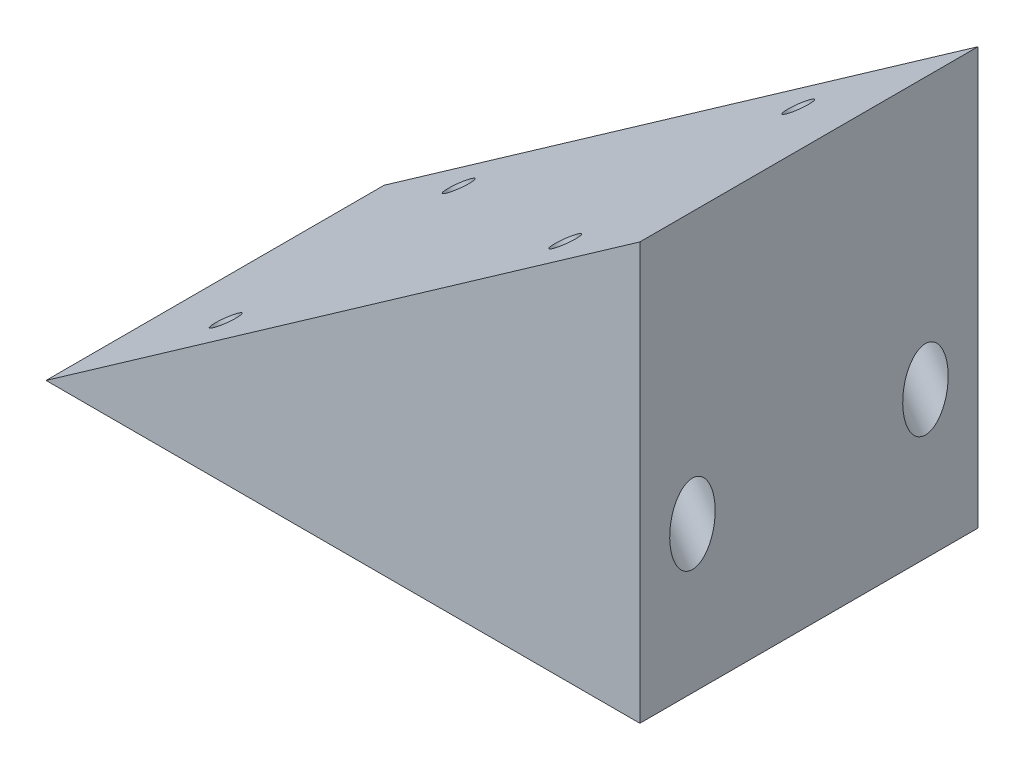
ISO-10303-21;
HEADER;
FILE_DESCRIPTION(('STEP AP214'),'2;1');
FILE_NAME('part.step','',(''),(''),'','','');
FILE_SCHEMA(('AUTOMOTIVE_DESIGN { 1 0 10303 214 1 1 1 1 }'));
ENDSEC;
DATA;
#1=APPLICATION_CONTEXT('core data for automotive mechanical design processes');
#2=APPLICATION_PROTOCOL_DEFINITION('international standard','automotive_design',2000,#1);
#3=PRODUCT_CONTEXT('',#1,'mechanical');
#4=PRODUCT('Part','Part','',(#3));
#5=PRODUCT_RELATED_PRODUCT_CATEGORY('part','',(#4));
#6=PRODUCT_DEFINITION_FORMATION('','',#4);
#7=PRODUCT_DEFINITION_CONTEXT('part definition',#1,'design');
#8=PRODUCT_DEFINITION('design','',#6,#7);
#9=PRODUCT_DEFINITION_SHAPE('','',#8);
#10=(LENGTH_UNIT() NAMED_UNIT(*) SI_UNIT(.MILLI.,.METRE.));
#11=(NAMED_UNIT(*) PLANE_ANGLE_UNIT() SI_UNIT($,.RADIAN.));
#12=(NAMED_UNIT(*) SI_UNIT($,.STERADIAN.) SOLID_ANGLE_UNIT());
#13=UNCERTAINTY_MEASURE_WITH_UNIT(LENGTH_MEASURE(1.E-05),#10,'distance_accuracy_value','');
#14=(GEOMETRIC_REPRESENTATION_CONTEXT(3) GLOBAL_UNCERTAINTY_ASSIGNED_CONTEXT((#13)) GLOBAL_UNIT_ASSIGNED_CONTEXT((#10,
#11,#12)) REPRESENTATION_CONTEXT('',''));
#15=CARTESIAN_POINT('',(0.,0.,0.));
#16=DIRECTION('',(0.,0.,1.));
#17=DIRECTION('',(1.,0.,0.));
#18=AXIS2_PLACEMENT_3D('',#15,#16,#17);
#19=CARTESIAN_POINT('',(52.25,73.36,29.75));
#20=DIRECTION('',(-1.,0.,0.));
#21=DIRECTION('',(0.,0.,1.));
#22=AXIS2_PLACEMENT_3D('',#19,#20,#21);
#23=PLANE('',#22);
#24=CARTESIAN_POINT('',(52.25,25.7770596393157,-20.5));
#25=DIRECTION('',(-1.,0.,0.));
#26=DIRECTION('',(0.,-1.,0.));
#27=AXIS2_PLACEMENT_3D('',#24,#25,#26);
#28=ELLIPSE('',#27,6.96178021711686,3.99999999999999);
#29=CARTESIAN_POINT('',(52.25,18.8152794221989,-20.5));
#30=VERTEX_POINT('',#29);
#31=EDGE_CURVE('E43',#30,#30,#28,.T.);
#32=ORIENTED_EDGE('',*,*,#31,.T.);
#33=EDGE_LOOP('',(#32));
#34=FACE_BOUND('',#33,.T.);
#35=CARTESIAN_POINT('',(52.25,25.7770596393157,20.5));
#36=DIRECTION('',(-1.,0.,0.));
#37=DIRECTION('',(0.,-1.,0.));
#38=AXIS2_PLACEMENT_3D('',#35,#36,#37);
#39=ELLIPSE('',#38,6.96178021711686,3.99999999999999);
#40=CARTESIAN_POINT('',(52.25,18.8152794221989,20.5));
#41=VERTEX_POINT('',#40);
#42=EDGE_CURVE('E117',#41,#41,#39,.T.);
#43=ORIENTED_EDGE('',*,*,#42,.T.);
#44=EDGE_LOOP('',(#43));
#45=FACE_BOUND('',#44,.T.);
#46=DIRECTION('',(0.,0.,-1.));
#47=VECTOR('',#46,1.);
#48=CARTESIAN_POINT('',(52.25,0.,29.75));
#49=LINE('',#48,#47);
#50=CARTESIAN_POINT('',(52.25,0.,29.75));
#51=VERTEX_POINT('',#50);
#52=CARTESIAN_POINT('',(52.25,0.,-29.75));
#53=VERTEX_POINT('',#52);
#54=EDGE_CURVE('E87',#51,#53,#49,.T.);
#55=ORIENTED_EDGE('',*,*,#54,.T.);
#56=DIRECTION('',(0.,-1.,0.));
#57=VECTOR('',#56,1.);
#58=CARTESIAN_POINT('',(52.25,73.36,-29.75));
#59=LINE('',#58,#57);
#60=CARTESIAN_POINT('',(52.25,73.36,-29.75));
#61=VERTEX_POINT('',#60);
#62=EDGE_CURVE('E11',#61,#53,#59,.T.);
#63=ORIENTED_EDGE('',*,*,#62,.F.);
#64=DIRECTION('',(0.,0.,-1.));
#65=VECTOR('',#64,1.);
#66=CARTESIAN_POINT('',(52.25,73.36,29.75));
#67=LINE('',#66,#65);
#68=CARTESIAN_POINT('',(52.25,73.36,29.75));
#69=VERTEX_POINT('',#68);
#70=EDGE_CURVE('E76',#69,#61,#67,.T.);
#71=ORIENTED_EDGE('',*,*,#70,.F.);
#72=DIRECTION('',(0.,-1.,0.));
#73=VECTOR('',#72,1.);
#74=CARTESIAN_POINT('',(52.25,73.36,29.75));
#75=LINE('',#74,#73);
#76=EDGE_CURVE('E48',#69,#51,#75,.T.);
#77=ORIENTED_EDGE('',*,*,#76,.T.);
#78=EDGE_LOOP('',(#55,#63,#71,#77));
#79=FACE_BOUND('',#78,.T.);
#80=ADVANCED_FACE('F40',(#34,#45,#79),#23,.F.);
#81=CARTESIAN_POINT('',(-52.25,73.36,-29.75));
#82=DIRECTION('',(0.,0.,1.));
#83=DIRECTION('',(1.,0.,0.));
#84=AXIS2_PLACEMENT_3D('',#81,#82,#83);
#85=PLANE('',#84);
#86=DIRECTION('',(-1.,0.,0.));
#87=VECTOR('',#86,1.);
#88=CARTESIAN_POINT('',(-52.25,0.,-29.75));
#89=LINE('',#88,#87);
#90=CARTESIAN_POINT('',(-52.25,0.,-29.75));
#91=VERTEX_POINT('',#90);
#92=EDGE_CURVE('E85',#53,#91,#89,.T.);
#93=ORIENTED_EDGE('',*,*,#92,.T.);
#94=DIRECTION('',(0.818458475917246,0.574565682232432,0.));
#95=VECTOR('',#94,1.);
#96=CARTESIAN_POINT('',(-52.25,0.,-29.75));
#97=LINE('',#96,#95);
#98=EDGE_CURVE('E64',#91,#61,#97,.T.);
#99=ORIENTED_EDGE('',*,*,#98,.T.);
#100=ORIENTED_EDGE('',*,*,#62,.T.);
#101=EDGE_LOOP('',(#93,#99,#100));
#102=FACE_BOUND('',#101,.T.);
#103=ADVANCED_FACE('F83',(#102),#85,.F.);
#104=CARTESIAN_POINT('',(-52.25,73.36,29.75));
#105=DIRECTION('',(0.,0.,-1.));
#106=DIRECTION('',(-1.,0.,0.));
#107=AXIS2_PLACEMENT_3D('',#104,#105,#106);
#108=PLANE('',#107);
#109=ORIENTED_EDGE('',*,*,#76,.F.);
#110=DIRECTION('',(0.818458475917246,0.574565682232432,0.));
#111=VECTOR('',#110,1.);
#112=CARTESIAN_POINT('',(-52.25,0.,29.75));
#113=LINE('',#112,#111);
#114=CARTESIAN_POINT('',(-52.25,0.,29.75));
#115=VERTEX_POINT('',#114);
#116=EDGE_CURVE('E78',#115,#69,#113,.T.);
#117=ORIENTED_EDGE('',*,*,#116,.F.);
#118=DIRECTION('',(1.,0.,0.));
#119=VECTOR('',#118,1.);
#120=CARTESIAN_POINT('',(-52.25,0.,29.75));
#121=LINE('',#120,#119);
#122=EDGE_CURVE('E56',#115,#51,#121,.T.);
#123=ORIENTED_EDGE('',*,*,#122,.T.);
#124=EDGE_LOOP('',(#109,#117,#123));
#125=FACE_BOUND('',#124,.T.);
#126=ADVANCED_FACE('F176',(#125),#108,.F.);
#127=CARTESIAN_POINT('',(0.,0.,0.));
#128=DIRECTION('',(0.,-1.,0.));
#129=DIRECTION('',(0.,0.,-1.));
#130=AXIS2_PLACEMENT_3D('',#127,#128,#129);
#131=PLANE('',#130);
#132=CARTESIAN_POINT('',(-18.8463205276575,0.,20.5));
#133=DIRECTION('',(0.,-1.,0.));
#134=DIRECTION('',(1.,0.,0.));
#135=AXIS2_PLACEMENT_3D('',#132,#133,#134);
#136=ELLIPSE('',#135,4.88723633232242,3.99999999999999);
#137=CARTESIAN_POINT('',(-13.959084195335,0.,20.5));
#138=VERTEX_POINT('',#137);
#139=EDGE_CURVE('E109',#138,#138,#136,.T.);
#140=ORIENTED_EDGE('',*,*,#139,.F.);
#141=EDGE_LOOP('',(#140));
#142=FACE_BOUND('',#141,.T.);
#143=CARTESIAN_POINT('',(-18.8463205276575,0.,-20.5));
#144=DIRECTION('',(0.,-1.,0.));
#145=DIRECTION('',(1.,0.,0.));
#146=AXIS2_PLACEMENT_3D('',#143,#144,#145);
#147=ELLIPSE('',#146,4.88723633232242,3.99999999999999);
#148=CARTESIAN_POINT('',(-13.959084195335,0.,-20.5));
#149=VERTEX_POINT('',#148);
#150=EDGE_CURVE('E102',#149,#149,#147,.T.);
#151=ORIENTED_EDGE('',*,*,#150,.F.);
#152=EDGE_LOOP('',(#151));
#153=FACE_BOUND('',#152,.T.);
#154=ORIENTED_EDGE('',*,*,#54,.F.);
#155=ORIENTED_EDGE('',*,*,#122,.F.);
#156=DIRECTION('',(0.,0.,1.));
#157=VECTOR('',#156,1.);
#158=CARTESIAN_POINT('',(-52.25,0.,29.75));
#159=LINE('',#158,#157);
#160=EDGE_CURVE('E92',#91,#115,#159,.T.);
#161=ORIENTED_EDGE('',*,*,#160,.F.);
#162=ORIENTED_EDGE('',*,*,#92,.F.);
#163=EDGE_LOOP('',(#154,#155,#161,#162));
#164=FACE_BOUND('',#163,.T.);
#165=ADVANCED_FACE('F218',(#142,#153,#164),#131,.T.);
#166=CARTESIAN_POINT('',(-52.25,0.,-29.75));
#167=DIRECTION('',(0.574565682232432,-0.818458475917245,0.));
#168=DIRECTION('',(0.818458475917246,0.574565682232432,0.));
#169=AXIS2_PLACEMENT_3D('',#166,#167,#168);
#170=PLANE('',#169);
#171=CARTESIAN_POINT('',(29.8737343709794,57.6516474014838,-20.5));
#172=DIRECTION('',(0.574565682232432,-0.818458475917245,0.));
#173=DIRECTION('',(0.818458475917246,0.574565682232432,0.));
#174=AXIS2_PLACEMENT_3D('',#171,#172,#173);
#175=CIRCLE('',#174,2.24999999999999);
#176=CARTESIAN_POINT('',(31.7152659417932,58.9444201865067,-20.5));
#177=VERTEX_POINT('',#176);
#178=EDGE_CURVE('E121',#177,#177,#175,.T.);
#179=ORIENTED_EDGE('',*,*,#178,.T.);
#180=EDGE_LOOP('',(#179));
#181=FACE_BOUND('',#180,.T.);
#182=CARTESIAN_POINT('',(29.8737343709794,57.6516474014838,20.5));
#183=DIRECTION('',(0.574565682232432,-0.818458475917245,0.));
#184=DIRECTION('',(0.818458475917246,0.574565682232432,0.));
#185=AXIS2_PLACEMENT_3D('',#182,#183,#184);
#186=CIRCLE('',#185,2.24999999999999);
#187=CARTESIAN_POINT('',(31.7152659417932,58.9444201865067,20.5));
#188=VERTEX_POINT('',#187);
#189=EDGE_CURVE('E114',#188,#188,#186,.T.);
#190=ORIENTED_EDGE('',*,*,#189,.T.);
#191=EDGE_LOOP('',(#190));
#192=FACE_BOUND('',#191,.T.);
#193=CARTESIAN_POINT('',(-29.8737343709795,15.7083525985162,20.5));
#194=DIRECTION('',(0.574565682232432,-0.818458475917245,0.));
#195=DIRECTION('',(0.818458475917246,0.574565682232432,0.));
#196=AXIS2_PLACEMENT_3D('',#193,#194,#195);
#197=CIRCLE('',#196,2.24999999999999);
#198=CARTESIAN_POINT('',(-28.0322028001657,17.0011253835392,20.5));
#199=VERTEX_POINT('',#198);
#200=EDGE_CURVE('E106',#199,#199,#197,.T.);
#201=ORIENTED_EDGE('',*,*,#200,.T.);
#202=EDGE_LOOP('',(#201));
#203=FACE_BOUND('',#202,.T.);
#204=CARTESIAN_POINT('',(-29.8737343709795,15.7083525985162,-20.5));
#205=DIRECTION('',(0.574565682232432,-0.818458475917245,0.));
#206=DIRECTION('',(0.818458475917246,0.574565682232432,0.));
#207=AXIS2_PLACEMENT_3D('',#204,#205,#206);
#208=CIRCLE('',#207,2.24999999999999);
#209=CARTESIAN_POINT('',(-28.0322028001657,17.0011253835392,-20.5));
#210=VERTEX_POINT('',#209);
#211=EDGE_CURVE('E99',#210,#210,#208,.T.);
#212=ORIENTED_EDGE('',*,*,#211,.T.);
#213=EDGE_LOOP('',(#212));
#214=FACE_BOUND('',#213,.T.);
#215=ORIENTED_EDGE('',*,*,#116,.T.);
#216=ORIENTED_EDGE('',*,*,#70,.T.);
#217=ORIENTED_EDGE('',*,*,#98,.F.);
#218=ORIENTED_EDGE('',*,*,#160,.T.);
#219=EDGE_LOOP('',(#215,#216,#217,#218));
#220=FACE_BOUND('',#219,.T.);
#221=ADVANCED_FACE('F77',(#181,#192,#203,#214,#220),#170,.F.);
#222=CARTESIAN_POINT('',(-1.14545025935788,-25.214571197346,-20.5));
#223=DIRECTION('',(0.574565682232432,-0.818458475917245,0.));
#224=DIRECTION('',(0.818458475917245,0.574565682232432,0.));
#225=AXIS2_PLACEMENT_3D('',#222,#223,#224);
#226=CYLINDRICAL_SURFACE('',#225,2.24999999999999);
#227=CARTESIAN_POINT('',(-26.4263402775849,10.7976017430127,-20.5));
#228=DIRECTION('',(0.574565682232432,-0.818458475917245,0.));
#229=DIRECTION('',(0.818458475917245,0.574565682232432,0.));
#230=AXIS2_PLACEMENT_3D('',#227,#228,#229);
#231=CIRCLE('',#230,2.25);
#232=CARTESIAN_POINT('',(-24.5848087067711,12.0903745280357,-20.5));
#233=VERTEX_POINT('',#232);
#234=EDGE_CURVE('E103',#233,#233,#231,.T.);
#235=ORIENTED_EDGE('',*,*,#234,.T.);
#236=EDGE_LOOP('',(#235));
#237=FACE_BOUND('',#236,.T.);
#238=ORIENTED_EDGE('',*,*,#211,.F.);
#239=EDGE_LOOP('',(#238));
#240=FACE_BOUND('',#239,.T.);
#241=ADVANCED_FACE('F149',(#237,#240),#226,.F.);
#242=CARTESIAN_POINT('',(-26.4263402775849,10.7976017430127,-16.5));
#243=DIRECTION('',(-0.574565682232432,0.818458475917245,0.));
#244=DIRECTION('',(-0.818458475917245,-0.574565682232432,0.));
#245=AXIS2_PLACEMENT_3D('',#242,#243,#244);
#246=PLANE('',#245);
#247=ORIENTED_EDGE('',*,*,#234,.F.);
#248=EDGE_LOOP('',(#247));
#249=FACE_BOUND('',#248,.T.);
#250=CARTESIAN_POINT('',(-26.4263402775849,10.7976017430127,-20.5));
#251=DIRECTION('',(0.574565682232432,-0.818458475917245,0.));
#252=DIRECTION('',(0.818458475917245,0.574565682232432,0.));
#253=AXIS2_PLACEMENT_3D('',#250,#251,#252);
#254=CIRCLE('',#253,3.99999999999999);
#255=CARTESIAN_POINT('',(-23.1525063739159,13.0958644719425,-20.5));
#256=VERTEX_POINT('',#255);
#257=EDGE_CURVE('E113',#256,#256,#254,.T.);
#258=ORIENTED_EDGE('',*,*,#257,.T.);
#259=EDGE_LOOP('',(#258));
#260=FACE_BOUND('',#259,.T.);
#261=ADVANCED_FACE('F152',(#249,#260),#246,.F.);
#262=CARTESIAN_POINT('',(-1.14545025935788,-25.214571197346,-20.5));
#263=DIRECTION('',(0.574565682232432,-0.818458475917245,0.));
#264=DIRECTION('',(0.818458475917245,0.574565682232432,0.));
#265=AXIS2_PLACEMENT_3D('',#262,#263,#264);
#266=CYLINDRICAL_SURFACE('',#265,3.99999999999999);
#267=ORIENTED_EDGE('',*,*,#150,.T.);
#268=EDGE_LOOP('',(#267));
#269=FACE_BOUND('',#268,.T.);
#270=ORIENTED_EDGE('',*,*,#257,.F.);
#271=EDGE_LOOP('',(#270));
#272=FACE_BOUND('',#271,.T.);
#273=ADVANCED_FACE('F155',(#269,#272),#266,.F.);
#274=CARTESIAN_POINT('',(-1.14545025935788,-25.214571197346,20.5));
#275=DIRECTION('',(0.574565682232432,-0.818458475917245,0.));
#276=DIRECTION('',(0.818458475917245,0.574565682232432,0.));
#277=AXIS2_PLACEMENT_3D('',#274,#275,#276);
#278=CYLINDRICAL_SURFACE('',#277,2.24999999999999);
#279=CARTESIAN_POINT('',(-26.4263402775849,10.7976017430127,20.5));
#280=DIRECTION('',(0.574565682232432,-0.818458475917245,0.));
#281=DIRECTION('',(0.818458475917245,0.574565682232432,0.));
#282=AXIS2_PLACEMENT_3D('',#279,#280,#281);
#283=CIRCLE('',#282,2.25);
#284=CARTESIAN_POINT('',(-24.5848087067711,12.0903745280357,20.5));
#285=VERTEX_POINT('',#284);
#286=EDGE_CURVE('E110',#285,#285,#283,.T.);
#287=ORIENTED_EDGE('',*,*,#286,.T.);
#288=EDGE_LOOP('',(#287));
#289=FACE_BOUND('',#288,.T.);
#290=ORIENTED_EDGE('',*,*,#200,.F.);
#291=EDGE_LOOP('',(#290));
#292=FACE_BOUND('',#291,.T.);
#293=ADVANCED_FACE('F160',(#289,#292),#278,.F.);
#294=CARTESIAN_POINT('',(-26.4263402775849,10.7976017430127,24.5));
#295=DIRECTION('',(-0.574565682232432,0.818458475917245,0.));
#296=DIRECTION('',(-0.818458475917245,-0.574565682232432,0.));
#297=AXIS2_PLACEMENT_3D('',#294,#295,#296);
#298=PLANE('',#297);
#299=ORIENTED_EDGE('',*,*,#286,.F.);
#300=EDGE_LOOP('',(#299));
#301=FACE_BOUND('',#300,.T.);
#302=CARTESIAN_POINT('',(-26.4263402775849,10.7976017430127,20.5));
#303=DIRECTION('',(0.574565682232432,-0.818458475917245,0.));
#304=DIRECTION('',(0.818458475917245,0.574565682232432,0.));
#305=AXIS2_PLACEMENT_3D('',#302,#303,#304);
#306=CIRCLE('',#305,3.99999999999999);
#307=CARTESIAN_POINT('',(-23.1525063739159,13.0958644719425,20.5));
#308=VERTEX_POINT('',#307);
#309=EDGE_CURVE('E120',#308,#308,#306,.T.);
#310=ORIENTED_EDGE('',*,*,#309,.T.);
#311=EDGE_LOOP('',(#310));
#312=FACE_BOUND('',#311,.T.);
#313=ADVANCED_FACE('F166',(#301,#312),#298,.F.);
#314=CARTESIAN_POINT('',(-1.14545025935788,-25.214571197346,20.5));
#315=DIRECTION('',(0.574565682232432,-0.818458475917245,0.));
#316=DIRECTION('',(0.818458475917245,0.574565682232432,0.));
#317=AXIS2_PLACEMENT_3D('',#314,#315,#316);
#318=CYLINDRICAL_SURFACE('',#317,3.99999999999999);
#319=ORIENTED_EDGE('',*,*,#139,.T.);
#320=EDGE_LOOP('',(#319));
#321=FACE_BOUND('',#320,.T.);
#322=ORIENTED_EDGE('',*,*,#309,.F.);
#323=EDGE_LOOP('',(#322));
#324=FACE_BOUND('',#323,.T.);
#325=ADVANCED_FACE('F184',(#321,#324),#318,.F.);
#326=CARTESIAN_POINT('',(58.602018482601,16.7287236056215,20.5));
#327=DIRECTION('',(0.574565682232432,-0.818458475917245,0.));
#328=DIRECTION('',(0.818458475917245,0.574565682232432,0.));
#329=AXIS2_PLACEMENT_3D('',#326,#327,#328);
#330=CYLINDRICAL_SURFACE('',#329,3.99999999999999);
#331=CARTESIAN_POINT('',(33.321128464374,52.7408965459803,20.5));
#332=DIRECTION('',(0.574565682232432,-0.818458475917245,0.));
#333=DIRECTION('',(0.818458475917245,0.574565682232432,0.));
#334=AXIS2_PLACEMENT_3D('',#331,#332,#333);
#335=CIRCLE('',#334,3.99999999999999);
#336=CARTESIAN_POINT('',(36.594962368043,55.03915927491,20.5));
#337=VERTEX_POINT('',#336);
#338=EDGE_CURVE('E127',#337,#337,#335,.T.);
#339=ORIENTED_EDGE('',*,*,#338,.F.);
#340=EDGE_LOOP('',(#339));
#341=FACE_BOUND('',#340,.T.);
#342=ORIENTED_EDGE('',*,*,#42,.F.);
#343=EDGE_LOOP('',(#342));
#344=FACE_BOUND('',#343,.T.);
#345=ADVANCED_FACE('F181',(#341,#344),#330,.F.);
#346=CARTESIAN_POINT('',(58.602018482601,16.7287236056215,20.5));
#347=DIRECTION('',(0.574565682232432,-0.818458475917245,0.));
#348=DIRECTION('',(0.818458475917245,0.574565682232432,0.));
#349=AXIS2_PLACEMENT_3D('',#346,#347,#348);
#350=CYLINDRICAL_SURFACE('',#349,2.24999999999999);
#351=CARTESIAN_POINT('',(33.321128464374,52.7408965459803,20.5));
#352=DIRECTION('',(0.574565682232432,-0.818458475917245,0.));
#353=DIRECTION('',(0.818458475917245,0.574565682232432,0.));
#354=AXIS2_PLACEMENT_3D('',#351,#352,#353);
#355=CIRCLE('',#354,2.25);
#356=CARTESIAN_POINT('',(35.1626600351878,54.0336693310032,20.5));
#357=VERTEX_POINT('',#356);
#358=EDGE_CURVE('E118',#357,#357,#355,.T.);
#359=ORIENTED_EDGE('',*,*,#358,.T.);
#360=EDGE_LOOP('',(#359));
#361=FACE_BOUND('',#360,.T.);
#362=ORIENTED_EDGE('',*,*,#189,.F.);
#363=EDGE_LOOP('',(#362));
#364=FACE_BOUND('',#363,.T.);
#365=ADVANCED_FACE('F183',(#361,#364),#350,.F.);
#366=CARTESIAN_POINT('',(33.321128464374,52.7408965459803,24.5));
#367=DIRECTION('',(-0.574565682232432,0.818458475917245,0.));
#368=DIRECTION('',(-0.818458475917245,-0.574565682232432,0.));
#369=AXIS2_PLACEMENT_3D('',#366,#367,#368);
#370=PLANE('',#369);
#371=ORIENTED_EDGE('',*,*,#358,.F.);
#372=EDGE_LOOP('',(#371));
#373=FACE_BOUND('',#372,.T.);
#374=ORIENTED_EDGE('',*,*,#338,.T.);
#375=EDGE_LOOP('',(#374));
#376=FACE_BOUND('',#375,.T.);
#377=ADVANCED_FACE('F191',(#373,#376),#370,.F.);
#378=CARTESIAN_POINT('',(58.602018482601,16.7287236056215,-20.5));
#379=DIRECTION('',(0.574565682232432,-0.818458475917245,0.));
#380=DIRECTION('',(0.818458475917245,0.574565682232432,0.));
#381=AXIS2_PLACEMENT_3D('',#378,#379,#380);
#382=CYLINDRICAL_SURFACE('',#381,3.99999999999999);
#383=CARTESIAN_POINT('',(33.321128464374,52.7408965459803,-20.5));
#384=DIRECTION('',(0.574565682232432,-0.818458475917245,0.));
#385=DIRECTION('',(0.818458475917245,0.574565682232432,0.));
#386=AXIS2_PLACEMENT_3D('',#383,#384,#385);
#387=CIRCLE('',#386,3.99999999999999);
#388=CARTESIAN_POINT('',(36.594962368043,55.03915927491,-20.5));
#389=VERTEX_POINT('',#388);
#390=EDGE_CURVE('E129',#389,#389,#387,.T.);
#391=ORIENTED_EDGE('',*,*,#390,.F.);
#392=EDGE_LOOP('',(#391));
#393=FACE_BOUND('',#392,.T.);
#394=ORIENTED_EDGE('',*,*,#31,.F.);
#395=EDGE_LOOP('',(#394));
#396=FACE_BOUND('',#395,.T.);
#397=ADVANCED_FACE('F202',(#393,#396),#382,.F.);
#398=CARTESIAN_POINT('',(58.602018482601,16.7287236056215,-20.5));
#399=DIRECTION('',(0.574565682232432,-0.818458475917245,0.));
#400=DIRECTION('',(0.818458475917245,0.574565682232432,0.));
#401=AXIS2_PLACEMENT_3D('',#398,#399,#400);
#402=CYLINDRICAL_SURFACE('',#401,2.24999999999999);
#403=CARTESIAN_POINT('',(33.321128464374,52.7408965459803,-20.5));
#404=DIRECTION('',(0.574565682232432,-0.818458475917245,0.));
#405=DIRECTION('',(0.818458475917245,0.574565682232432,0.));
#406=AXIS2_PLACEMENT_3D('',#403,#404,#405);
#407=CIRCLE('',#406,2.25);
#408=CARTESIAN_POINT('',(35.1626600351878,54.0336693310032,-20.5));
#409=VERTEX_POINT('',#408);
#410=EDGE_CURVE('E123',#409,#409,#407,.T.);
#411=ORIENTED_EDGE('',*,*,#410,.T.);
#412=EDGE_LOOP('',(#411));
#413=FACE_BOUND('',#412,.T.);
#414=ORIENTED_EDGE('',*,*,#178,.F.);
#415=EDGE_LOOP('',(#414));
#416=FACE_BOUND('',#415,.T.);
#417=ADVANCED_FACE('F199',(#413,#416),#402,.F.);
#418=CARTESIAN_POINT('',(33.321128464374,52.7408965459803,-16.5));
#419=DIRECTION('',(-0.574565682232432,0.818458475917245,0.));
#420=DIRECTION('',(-0.818458475917245,-0.574565682232432,0.));
#421=AXIS2_PLACEMENT_3D('',#418,#419,#420);
#422=PLANE('',#421);
#423=ORIENTED_EDGE('',*,*,#410,.F.);
#424=EDGE_LOOP('',(#423));
#425=FACE_BOUND('',#424,.T.);
#426=ORIENTED_EDGE('',*,*,#390,.T.);
#427=EDGE_LOOP('',(#426));
#428=FACE_BOUND('',#427,.T.);
#429=ADVANCED_FACE('F308',(#425,#428),#422,.F.);
#430=CLOSED_SHELL('',(#80,#103,#126,#165,#221,#241,#261,#273,#293,#313,#325,#345,#365,#377,#397,
#417,#429));
#431=MANIFOLD_SOLID_BREP('B2',#430);
#432=ADVANCED_BREP_SHAPE_REPRESENTATION('',(#18,#431),#14);
#433=SHAPE_DEFINITION_REPRESENTATION(#9,#432);
ENDSEC;
END-ISO-10303-21;
